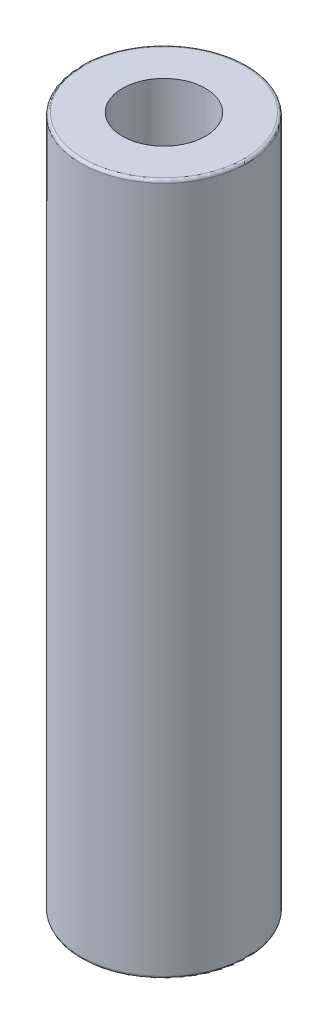
ISO-10303-21;
HEADER;
FILE_DESCRIPTION(('STEP AP214'),'2;1');
FILE_NAME('part.step','',(''),(''),'','','');
FILE_SCHEMA(('AUTOMOTIVE_DESIGN { 1 0 10303 214 1 1 1 1 }'));
ENDSEC;
DATA;
#1=APPLICATION_CONTEXT('core data for automotive mechanical design processes');
#2=APPLICATION_PROTOCOL_DEFINITION('international standard','automotive_design',2000,#1);
#3=PRODUCT_CONTEXT('',#1,'mechanical');
#4=PRODUCT('Part','Part','',(#3));
#5=PRODUCT_RELATED_PRODUCT_CATEGORY('part','',(#4));
#6=PRODUCT_DEFINITION_FORMATION('','',#4);
#7=PRODUCT_DEFINITION_CONTEXT('part definition',#1,'design');
#8=PRODUCT_DEFINITION('design','',#6,#7);
#9=PRODUCT_DEFINITION_SHAPE('','',#8);
#10=(LENGTH_UNIT() NAMED_UNIT(*) SI_UNIT(.MILLI.,.METRE.));
#11=(NAMED_UNIT(*) PLANE_ANGLE_UNIT() SI_UNIT($,.RADIAN.));
#12=(NAMED_UNIT(*) SI_UNIT($,.STERADIAN.) SOLID_ANGLE_UNIT());
#13=UNCERTAINTY_MEASURE_WITH_UNIT(LENGTH_MEASURE(1.E-05),#10,'distance_accuracy_value','');
#14=(GEOMETRIC_REPRESENTATION_CONTEXT(3) GLOBAL_UNCERTAINTY_ASSIGNED_CONTEXT((#13)) GLOBAL_UNIT_ASSIGNED_CONTEXT((#10,
#11,#12)) REPRESENTATION_CONTEXT('',''));
#15=CARTESIAN_POINT('',(0.,0.,0.));
#16=DIRECTION('',(0.,0.,1.));
#17=DIRECTION('',(1.,0.,0.));
#18=AXIS2_PLACEMENT_3D('',#15,#16,#17);
#19=CARTESIAN_POINT('',(0.,25.,0.));
#20=DIRECTION('',(0.,1.,0.));
#21=DIRECTION('',(0.,0.,1.));
#22=AXIS2_PLACEMENT_3D('',#19,#20,#21);
#23=PLANE('',#22);
#24=CARTESIAN_POINT('',(0.,25.,0.));
#25=DIRECTION('',(0.,1.,0.));
#26=DIRECTION('',(0.,0.,1.));
#27=AXIS2_PLACEMENT_3D('',#24,#25,#26);
#28=CIRCLE('',#27,2.9);
#29=CARTESIAN_POINT('',(0.,25.,2.9));
#30=VERTEX_POINT('',#29);
#31=EDGE_CURVE('E46',#30,#30,#28,.T.);
#32=ORIENTED_EDGE('',*,*,#31,.T.);
#33=EDGE_LOOP('',(#32));
#34=FACE_BOUND('',#33,.T.);
#35=CARTESIAN_POINT('',(0.,25.,0.));
#36=DIRECTION('',(0.,1.,0.));
#37=DIRECTION('',(0.,0.,1.));
#38=AXIS2_PLACEMENT_3D('',#35,#36,#37);
#39=CIRCLE('',#38,1.5);
#40=CARTESIAN_POINT('',(0.,25.,1.5));
#41=VERTEX_POINT('',#40);
#42=EDGE_CURVE('E51',#41,#41,#39,.T.);
#43=ORIENTED_EDGE('',*,*,#42,.F.);
#44=EDGE_LOOP('',(#43));
#45=FACE_BOUND('',#44,.T.);
#46=ADVANCED_FACE('F31',(#34,#45),#23,.T.);
#47=CARTESIAN_POINT('',(0.,0.,0.));
#48=DIRECTION('',(0.,1.,0.));
#49=DIRECTION('',(0.,0.,1.));
#50=AXIS2_PLACEMENT_3D('',#47,#48,#49);
#51=PLANE('',#50);
#52=CARTESIAN_POINT('',(0.,0.,0.));
#53=DIRECTION('',(0.,1.,0.));
#54=DIRECTION('',(0.,0.,1.));
#55=AXIS2_PLACEMENT_3D('',#52,#53,#54);
#56=CIRCLE('',#55,2.9);
#57=CARTESIAN_POINT('',(0.,0.,2.9));
#58=VERTEX_POINT('',#57);
#59=EDGE_CURVE('E10',#58,#58,#56,.F.);
#60=ORIENTED_EDGE('',*,*,#59,.T.);
#61=EDGE_LOOP('',(#60));
#62=FACE_BOUND('',#61,.T.);
#63=CARTESIAN_POINT('',(0.,0.,0.));
#64=DIRECTION('',(0.,1.,0.));
#65=DIRECTION('',(0.,0.,1.));
#66=AXIS2_PLACEMENT_3D('',#63,#64,#65);
#67=CIRCLE('',#66,1.5);
#68=CARTESIAN_POINT('',(0.,0.,1.5));
#69=VERTEX_POINT('',#68);
#70=EDGE_CURVE('E52',#69,#69,#67,.T.);
#71=ORIENTED_EDGE('',*,*,#70,.T.);
#72=EDGE_LOOP('',(#71));
#73=FACE_BOUND('',#72,.T.);
#74=ADVANCED_FACE('F62',(#62,#73),#51,.F.);
#75=CARTESIAN_POINT('',(0.,25.,0.));
#76=DIRECTION('',(0.,-1.,0.));
#77=DIRECTION('',(0.,0.,-1.));
#78=AXIS2_PLACEMENT_3D('',#75,#76,#77);
#79=CYLINDRICAL_SURFACE('',#78,3.);
#80=CARTESIAN_POINT('',(0.,24.9,0.));
#81=DIRECTION('',(0.,1.,0.));
#82=DIRECTION('',(0.,0.,1.));
#83=AXIS2_PLACEMENT_3D('',#80,#81,#82);
#84=CIRCLE('',#83,3.);
#85=CARTESIAN_POINT('',(0.,24.9,3.));
#86=VERTEX_POINT('',#85);
#87=EDGE_CURVE('E38',#86,#86,#84,.F.);
#88=ORIENTED_EDGE('',*,*,#87,.T.);
#89=EDGE_LOOP('',(#88));
#90=FACE_BOUND('',#89,.T.);
#91=CARTESIAN_POINT('',(0.,0.0999999999999994,0.));
#92=DIRECTION('',(0.,1.,0.));
#93=DIRECTION('',(0.,0.,1.));
#94=AXIS2_PLACEMENT_3D('',#91,#92,#93);
#95=CIRCLE('',#94,3.);
#96=CARTESIAN_POINT('',(0.,0.0999999999999994,3.));
#97=VERTEX_POINT('',#96);
#98=EDGE_CURVE('E42',#97,#97,#95,.T.);
#99=ORIENTED_EDGE('',*,*,#98,.T.);
#100=EDGE_LOOP('',(#99));
#101=FACE_BOUND('',#100,.T.);
#102=ADVANCED_FACE('F68',(#90,#101),#79,.T.);
#103=CARTESIAN_POINT('',(0.,25.,0.));
#104=DIRECTION('',(0.,-1.,0.));
#105=DIRECTION('',(0.,0.,-1.));
#106=AXIS2_PLACEMENT_3D('',#103,#104,#105);
#107=CYLINDRICAL_SURFACE('',#106,1.5);
#108=ORIENTED_EDGE('',*,*,#42,.T.);
#109=EDGE_LOOP('',(#108));
#110=FACE_BOUND('',#109,.T.);
#111=ORIENTED_EDGE('',*,*,#70,.F.);
#112=EDGE_LOOP('',(#111));
#113=FACE_BOUND('',#112,.T.);
#114=ADVANCED_FACE('F58',(#110,#113),#107,.F.);
#115=CARTESIAN_POINT('',(0.,24.9,0.));
#116=DIRECTION('',(0.,1.,0.));
#117=DIRECTION('',(0.,0.,1.));
#118=AXIS2_PLACEMENT_3D('',#115,#116,#117);
#119=TOROIDAL_SURFACE('',#118,2.9,0.1);
#120=ORIENTED_EDGE('',*,*,#87,.F.);
#121=EDGE_LOOP('',(#120));
#122=FACE_BOUND('',#121,.T.);
#123=ORIENTED_EDGE('',*,*,#31,.F.);
#124=EDGE_LOOP('',(#123));
#125=FACE_BOUND('',#124,.T.);
#126=ADVANCED_FACE('F73',(#122,#125),#119,.T.);
#127=CARTESIAN_POINT('',(0.,0.0999999999999994,0.));
#128=DIRECTION('',(0.,1.,0.));
#129=DIRECTION('',(0.,0.,1.));
#130=AXIS2_PLACEMENT_3D('',#127,#128,#129);
#131=TOROIDAL_SURFACE('',#130,2.9,0.1);
#132=ORIENTED_EDGE('',*,*,#59,.F.);
#133=EDGE_LOOP('',(#132));
#134=FACE_BOUND('',#133,.T.);
#135=ORIENTED_EDGE('',*,*,#98,.F.);
#136=EDGE_LOOP('',(#135));
#137=FACE_BOUND('',#136,.T.);
#138=ADVANCED_FACE('F33',(#134,#137),#131,.T.);
#139=CLOSED_SHELL('',(#46,#74,#102,#114,#126,#138));
#140=MANIFOLD_SOLID_BREP('B2',#139);
#141=ADVANCED_BREP_SHAPE_REPRESENTATION('',(#18,#140),#14);
#142=SHAPE_DEFINITION_REPRESENTATION(#9,#141);
ENDSEC;
END-ISO-10303-21;
